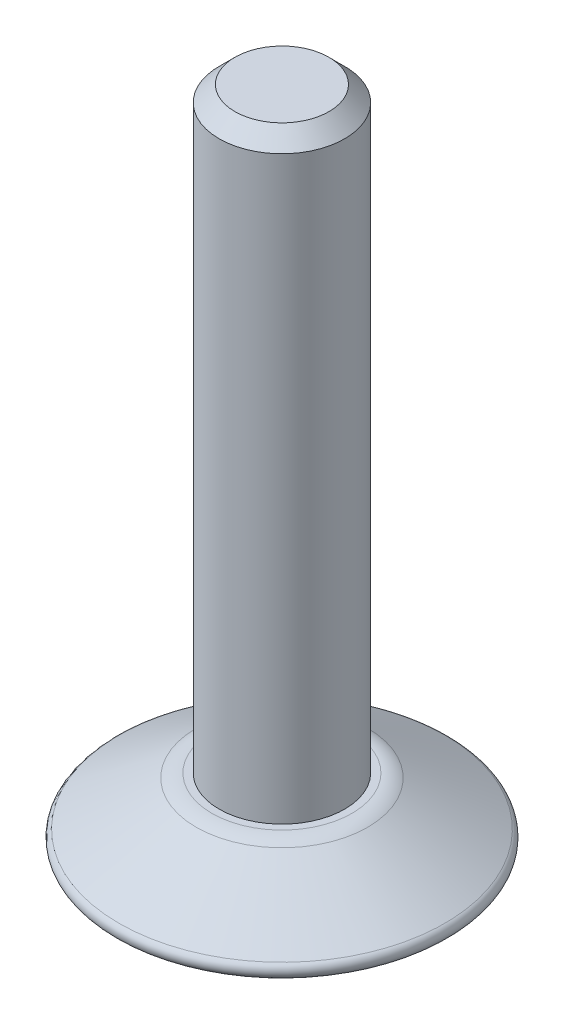
ISO-10303-21;
HEADER;
FILE_DESCRIPTION(('STEP AP214'),'2;1');
FILE_NAME('part.step','',(''),(''),'','','');
FILE_SCHEMA(('AUTOMOTIVE_DESIGN { 1 0 10303 214 1 1 1 1 }'));
ENDSEC;
DATA;
#1=APPLICATION_CONTEXT('core data for automotive mechanical design processes');
#2=APPLICATION_PROTOCOL_DEFINITION('international standard','automotive_design',2000,#1);
#3=PRODUCT_CONTEXT('',#1,'mechanical');
#4=PRODUCT('Part','Part','',(#3));
#5=PRODUCT_RELATED_PRODUCT_CATEGORY('part','',(#4));
#6=PRODUCT_DEFINITION_FORMATION('','',#4);
#7=PRODUCT_DEFINITION_CONTEXT('part definition',#1,'design');
#8=PRODUCT_DEFINITION('design','',#6,#7);
#9=PRODUCT_DEFINITION_SHAPE('','',#8);
#10=(LENGTH_UNIT() NAMED_UNIT(*) SI_UNIT(.MILLI.,.METRE.));
#11=(NAMED_UNIT(*) PLANE_ANGLE_UNIT() SI_UNIT($,.RADIAN.));
#12=(NAMED_UNIT(*) SI_UNIT($,.STERADIAN.) SOLID_ANGLE_UNIT());
#13=UNCERTAINTY_MEASURE_WITH_UNIT(LENGTH_MEASURE(1.E-05),#10,'distance_accuracy_value','');
#14=(GEOMETRIC_REPRESENTATION_CONTEXT(3) GLOBAL_UNCERTAINTY_ASSIGNED_CONTEXT((#13)) GLOBAL_UNIT_ASSIGNED_CONTEXT((#10,
#11,#12)) REPRESENTATION_CONTEXT('',''));
#15=CARTESIAN_POINT('',(0.,0.,0.));
#16=DIRECTION('',(0.,0.,1.));
#17=DIRECTION('',(1.,0.,0.));
#18=AXIS2_PLACEMENT_3D('',#15,#16,#17);
#19=CARTESIAN_POINT('',(0.,10.,0.));
#20=DIRECTION('',(0.,1.,0.));
#21=DIRECTION('',(0.,0.,1.));
#22=AXIS2_PLACEMENT_3D('',#19,#20,#21);
#23=PLANE('',#22);
#24=CARTESIAN_POINT('',(0.,10.,0.));
#25=DIRECTION('',(0.,1.,0.));
#26=DIRECTION('',(0.,0.,1.));
#27=AXIS2_PLACEMENT_3D('',#24,#25,#26);
#28=CIRCLE('',#27,2.23205080756885);
#29=CARTESIAN_POINT('',(0.,10.,2.23205080756885));
#30=VERTEX_POINT('',#29);
#31=EDGE_CURVE('E38',#30,#30,#28,.T.);
#32=ORIENTED_EDGE('',*,*,#31,.T.);
#33=EDGE_LOOP('',(#32));
#34=FACE_BOUND('',#33,.T.);
#35=CARTESIAN_POINT('',(0.,10.,0.));
#36=DIRECTION('',(0.,1.,0.));
#37=DIRECTION('',(0.,0.,1.));
#38=AXIS2_PLACEMENT_3D('',#35,#36,#37);
#39=CIRCLE('',#38,2.);
#40=CARTESIAN_POINT('',(0.,10.,2.));
#41=VERTEX_POINT('',#40);
#42=EDGE_CURVE('E57',#41,#41,#39,.T.);
#43=ORIENTED_EDGE('',*,*,#42,.F.);
#44=EDGE_LOOP('',(#43));
#45=FACE_BOUND('',#44,.T.);
#46=ADVANCED_FACE('F31',(#34,#45),#23,.T.);
#47=CARTESIAN_POINT('',(0.,10.,0.));
#48=DIRECTION('',(0.,-1.,0.));
#49=DIRECTION('',(0.,0.,-1.));
#50=AXIS2_PLACEMENT_3D('',#47,#48,#49);
#51=CONICAL_SURFACE('',#50,2.49999999999998,1.0471975511966);
#52=CARTESIAN_POINT('',(0.,9.86602540378444,0.));
#53=DIRECTION('',(0.,1.,0.));
#54=DIRECTION('',(0.,0.,1.));
#55=AXIS2_PLACEMENT_3D('',#52,#53,#54);
#56=CIRCLE('',#55,2.73205080756885);
#57=CARTESIAN_POINT('',(0.,9.86602540378444,2.73205080756885));
#58=VERTEX_POINT('',#57);
#59=EDGE_CURVE('E10',#58,#58,#56,.F.);
#60=ORIENTED_EDGE('',*,*,#59,.T.);
#61=EDGE_LOOP('',(#60));
#62=FACE_BOUND('',#61,.T.);
#63=CARTESIAN_POINT('',(0.,8.44578040878241,0.));
#64=DIRECTION('',(0.,-1.,0.));
#65=DIRECTION('',(0.,0.,-1.));
#66=AXIS2_PLACEMENT_3D('',#63,#64,#65);
#67=CIRCLE('',#66,5.19198729810778);
#68=CARTESIAN_POINT('',(0.,8.44578040878241,-5.19198729810778));
#69=VERTEX_POINT('',#68);
#70=EDGE_CURVE('E42',#69,#69,#67,.F.);
#71=ORIENTED_EDGE('',*,*,#70,.T.);
#72=EDGE_LOOP('',(#71));
#73=FACE_BOUND('',#72,.T.);
#74=ADVANCED_FACE('F64',(#62,#73),#51,.T.);
#75=CARTESIAN_POINT('',(-6.,7.9792740578363,-6.));
#76=DIRECTION('',(0.,1.,0.));
#77=DIRECTION('',(0.,0.,1.));
#78=AXIS2_PLACEMENT_3D('',#75,#76,#77);
#79=PLANE('',#78);
#80=CARTESIAN_POINT('',(0.,7.9792740578363,0.));
#81=DIRECTION('',(0.,1.,0.));
#82=DIRECTION('',(0.,0.,1.));
#83=AXIS2_PLACEMENT_3D('',#80,#81,#82);
#84=CIRCLE('',#83,5.06698729810778);
#85=CARTESIAN_POINT('',(0.,7.9792740578363,5.06698729810778));
#86=VERTEX_POINT('',#85);
#87=EDGE_CURVE('E46',#86,#86,#84,.F.);
#88=ORIENTED_EDGE('',*,*,#87,.T.);
#89=EDGE_LOOP('',(#88));
#90=FACE_BOUND('',#89,.T.);
#91=ADVANCED_FACE('F69',(#90),#79,.F.);
#92=CARTESIAN_POINT('',(0.,29.,0.));
#93=DIRECTION('',(0.,-1.,0.));
#94=DIRECTION('',(0.,0.,-1.));
#95=AXIS2_PLACEMENT_3D('',#92,#93,#94);
#96=CYLINDRICAL_SURFACE('',#95,2.);
#97=CARTESIAN_POINT('',(0.,28.5,0.));
#98=DIRECTION('',(0.,1.,0.));
#99=DIRECTION('',(0.,0.,1.));
#100=AXIS2_PLACEMENT_3D('',#97,#98,#99);
#101=CIRCLE('',#100,2.);
#102=CARTESIAN_POINT('',(0.,28.5,2.));
#103=VERTEX_POINT('',#102);
#104=EDGE_CURVE('E51',#103,#103,#101,.F.);
#105=ORIENTED_EDGE('',*,*,#104,.T.);
#106=EDGE_LOOP('',(#105));
#107=FACE_BOUND('',#106,.T.);
#108=ORIENTED_EDGE('',*,*,#42,.T.);
#109=EDGE_LOOP('',(#108));
#110=FACE_BOUND('',#109,.T.);
#111=ADVANCED_FACE('F61',(#107,#110),#96,.T.);
#112=CARTESIAN_POINT('',(0.,29.,0.));
#113=DIRECTION('',(0.,1.,0.));
#114=DIRECTION('',(0.,0.,1.));
#115=AXIS2_PLACEMENT_3D('',#112,#113,#114);
#116=PLANE('',#115);
#117=CARTESIAN_POINT('',(0.,29.,0.));
#118=DIRECTION('',(0.,1.,0.));
#119=DIRECTION('',(0.,0.,1.));
#120=AXIS2_PLACEMENT_3D('',#117,#118,#119);
#121=CIRCLE('',#120,1.49999999999999);
#122=CARTESIAN_POINT('',(0.,29.,1.49999999999999));
#123=VERTEX_POINT('',#122);
#124=EDGE_CURVE('E54',#123,#123,#121,.T.);
#125=ORIENTED_EDGE('',*,*,#124,.T.);
#126=EDGE_LOOP('',(#125));
#127=FACE_BOUND('',#126,.T.);
#128=ADVANCED_FACE('F77',(#127),#116,.T.);
#129=CARTESIAN_POINT('',(0.,29.,0.));
#130=DIRECTION('',(0.,-1.,0.));
#131=DIRECTION('',(0.,0.,-1.));
#132=AXIS2_PLACEMENT_3D('',#129,#130,#131);
#133=CONICAL_SURFACE('',#132,1.49999999999999,0.785398163397447);
#134=ORIENTED_EDGE('',*,*,#104,.F.);
#135=EDGE_LOOP('',(#134));
#136=FACE_BOUND('',#135,.T.);
#137=ORIENTED_EDGE('',*,*,#124,.F.);
#138=EDGE_LOOP('',(#137));
#139=FACE_BOUND('',#138,.T.);
#140=ADVANCED_FACE('F74',(#136,#139),#133,.T.);
#141=CARTESIAN_POINT('',(0.,8.2292740578363,0.));
#142=DIRECTION('',(0.,1.,0.));
#143=DIRECTION('',(0.,0.,1.));
#144=AXIS2_PLACEMENT_3D('',#141,#142,#143);
#145=TOROIDAL_SURFACE('',#144,5.06698729810778,0.25);
#146=ORIENTED_EDGE('',*,*,#70,.F.);
#147=EDGE_LOOP('',(#146));
#148=FACE_BOUND('',#147,.T.);
#149=ORIENTED_EDGE('',*,*,#87,.F.);
#150=EDGE_LOOP('',(#149));
#151=FACE_BOUND('',#150,.T.);
#152=ADVANCED_FACE('F76',(#148,#151),#145,.T.);
#153=CARTESIAN_POINT('',(0.,9.,0.));
#154=DIRECTION('',(0.,1.,0.));
#155=DIRECTION('',(0.,0.,1.));
#156=AXIS2_PLACEMENT_3D('',#153,#154,#155);
#157=TOROIDAL_SURFACE('',#156,2.23205080756885,1.);
#158=ORIENTED_EDGE('',*,*,#59,.F.);
#159=EDGE_LOOP('',(#158));
#160=FACE_BOUND('',#159,.T.);
#161=ORIENTED_EDGE('',*,*,#31,.F.);
#162=EDGE_LOOP('',(#161));
#163=FACE_BOUND('',#162,.T.);
#164=ADVANCED_FACE('F33',(#160,#163),#157,.T.);
#165=CLOSED_SHELL('',(#46,#74,#91,#111,#128,#140,#152,#164));
#166=MANIFOLD_SOLID_BREP('B2',#165);
#167=ADVANCED_BREP_SHAPE_REPRESENTATION('',(#18,#166),#14);
#168=SHAPE_DEFINITION_REPRESENTATION(#9,#167);
ENDSEC;
END-ISO-10303-21;
